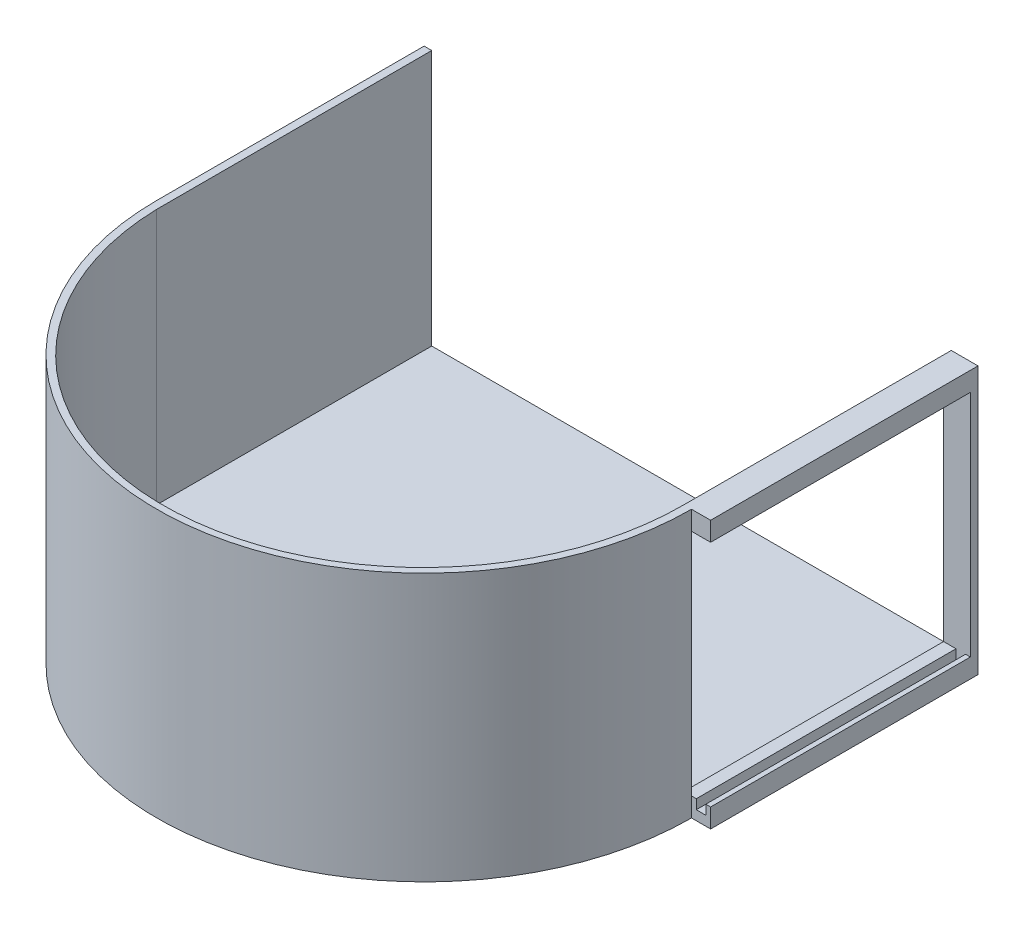
ISO-10303-21;
HEADER;
FILE_DESCRIPTION(('STEP AP214'),'2;1');
FILE_NAME('part.step','',(''),(''),'','','');
FILE_SCHEMA(('AUTOMOTIVE_DESIGN { 1 0 10303 214 1 1 1 1 }'));
ENDSEC;
DATA;
#1=APPLICATION_CONTEXT('core data for automotive mechanical design processes');
#2=APPLICATION_PROTOCOL_DEFINITION('international standard','automotive_design',2000,#1);
#3=PRODUCT_CONTEXT('',#1,'mechanical');
#4=PRODUCT('Part','Part','',(#3));
#5=PRODUCT_RELATED_PRODUCT_CATEGORY('part','',(#4));
#6=PRODUCT_DEFINITION_FORMATION('','',#4);
#7=PRODUCT_DEFINITION_CONTEXT('part definition',#1,'design');
#8=PRODUCT_DEFINITION('design','',#6,#7);
#9=PRODUCT_DEFINITION_SHAPE('','',#8);
#10=(LENGTH_UNIT() NAMED_UNIT(*) SI_UNIT(.MILLI.,.METRE.));
#11=(NAMED_UNIT(*) PLANE_ANGLE_UNIT() SI_UNIT($,.RADIAN.));
#12=(NAMED_UNIT(*) SI_UNIT($,.STERADIAN.) SOLID_ANGLE_UNIT());
#13=UNCERTAINTY_MEASURE_WITH_UNIT(LENGTH_MEASURE(1.E-05),#10,'distance_accuracy_value','');
#14=(GEOMETRIC_REPRESENTATION_CONTEXT(3) GLOBAL_UNCERTAINTY_ASSIGNED_CONTEXT((#13)) GLOBAL_UNIT_ASSIGNED_CONTEXT((#10,
#11,#12)) REPRESENTATION_CONTEXT('',''));
#15=CARTESIAN_POINT('',(0.,0.,0.));
#16=DIRECTION('',(0.,0.,1.));
#17=DIRECTION('',(1.,0.,0.));
#18=AXIS2_PLACEMENT_3D('',#15,#16,#17);
#19=CARTESIAN_POINT('',(184.15,6.35,0.));
#20=DIRECTION('',(0.,-1.,0.));
#21=DIRECTION('',(0.,0.,-1.));
#22=AXIS2_PLACEMENT_3D('',#19,#20,#21);
#23=PLANE('',#22);
#24=DIRECTION('',(0.,0.,1.));
#25=VECTOR('',#24,1.);
#26=CARTESIAN_POINT('',(179.3875,6.35,0.));
#27=LINE('',#26,#25);
#28=CARTESIAN_POINT('',(179.3875,6.35,-86.36));
#29=VERTEX_POINT('',#28);
#30=CARTESIAN_POINT('',(179.3875,6.35,0.));
#31=VERTEX_POINT('',#30);
#32=EDGE_CURVE('E506',#29,#31,#27,.T.);
#33=ORIENTED_EDGE('',*,*,#32,.F.);
#34=DIRECTION('',(-1.,0.,0.));
#35=VECTOR('',#34,1.);
#36=CARTESIAN_POINT('',(184.15,6.35,-86.36));
#37=LINE('',#36,#35);
#38=CARTESIAN_POINT('',(175.26,6.35,-86.36));
#39=VERTEX_POINT('',#38);
#40=EDGE_CURVE('E183',#29,#39,#37,.T.);
#41=ORIENTED_EDGE('',*,*,#40,.T.);
#42=DIRECTION('',(0.,0.,-1.));
#43=VECTOR('',#42,1.);
#44=CARTESIAN_POINT('',(175.26,6.35,0.));
#45=LINE('',#44,#43);
#46=CARTESIAN_POINT('',(175.26,6.35,0.));
#47=VERTEX_POINT('',#46);
#48=EDGE_CURVE('E185',#47,#39,#45,.T.);
#49=ORIENTED_EDGE('',*,*,#48,.F.);
#50=DIRECTION('',(1.,0.,0.));
#51=VECTOR('',#50,1.);
#52=CARTESIAN_POINT('',(175.26,6.35,0.));
#53=LINE('',#52,#51);
#54=CARTESIAN_POINT('',(177.8,6.35,0.));
#55=VERTEX_POINT('',#54);
#56=EDGE_CURVE('E169',#47,#55,#53,.T.);
#57=ORIENTED_EDGE('',*,*,#56,.T.);
#58=DIRECTION('',(-1.,0.,0.));
#59=VECTOR('',#58,1.);
#60=CARTESIAN_POINT('',(184.15,6.35,0.));
#61=LINE('',#60,#59);
#62=EDGE_CURVE('E259',#31,#55,#61,.T.);
#63=ORIENTED_EDGE('',*,*,#62,.F.);
#64=EDGE_LOOP('',(#33,#41,#49,#57,#63));
#65=FACE_BOUND('',#64,.T.);
#66=ADVANCED_FACE('F39',(#65),#23,.F.);
#67=DIRECTION('',(0.,0.,-1.));
#68=VECTOR('',#67,1.);
#69=CARTESIAN_POINT('',(182.5625,6.35,0.));
#70=LINE('',#69,#68);
#71=CARTESIAN_POINT('',(182.5625,6.35,0.));
#72=VERTEX_POINT('',#71);
#73=CARTESIAN_POINT('',(182.5625,6.35,-86.36));
#74=VERTEX_POINT('',#73);
#75=EDGE_CURVE('E501',#72,#74,#70,.T.);
#76=ORIENTED_EDGE('',*,*,#75,.F.);
#77=CARTESIAN_POINT('',(184.15,6.35,0.));
#78=VERTEX_POINT('',#77);
#79=EDGE_CURVE('E277',#78,#72,#61,.T.);
#80=ORIENTED_EDGE('',*,*,#79,.F.);
#81=DIRECTION('',(0.,0.,1.));
#82=VECTOR('',#81,1.);
#83=CARTESIAN_POINT('',(184.15,6.35,0.));
#84=LINE('',#83,#82);
#85=CARTESIAN_POINT('',(184.15,6.35,-86.36));
#86=VERTEX_POINT('',#85);
#87=EDGE_CURVE('E514',#86,#78,#84,.T.);
#88=ORIENTED_EDGE('',*,*,#87,.F.);
#89=EDGE_CURVE('E276',#86,#74,#37,.T.);
#90=ORIENTED_EDGE('',*,*,#89,.T.);
#91=EDGE_LOOP('',(#76,#80,#88,#90));
#92=FACE_BOUND('',#91,.T.);
#93=ADVANCED_FACE('F320',(#92),#23,.F.);
#94=CARTESIAN_POINT('',(88.9,88.9,0.));
#95=DIRECTION('',(0.,-1.,0.));
#96=DIRECTION('',(0.,0.,-1.));
#97=AXIS2_PLACEMENT_3D('',#94,#95,#96);
#98=CYLINDRICAL_SURFACE('',#97,88.9);
#99=CARTESIAN_POINT('',(88.9,0.,0.));
#100=DIRECTION('',(0.,1.,0.));
#101=DIRECTION('',(0.,0.,1.));
#102=AXIS2_PLACEMENT_3D('',#99,#100,#101);
#103=CIRCLE('',#102,88.9);
#104=CARTESIAN_POINT('',(0.,0.,0.));
#105=VERTEX_POINT('',#104);
#106=CARTESIAN_POINT('',(177.8,0.,0.));
#107=VERTEX_POINT('',#106);
#108=EDGE_CURVE('E223',#105,#107,#103,.T.);
#109=ORIENTED_EDGE('',*,*,#108,.T.);
#110=DIRECTION('',(0.,-1.,0.));
#111=VECTOR('',#110,1.);
#112=CARTESIAN_POINT('',(177.8,0.,0.));
#113=LINE('',#112,#111);
#114=EDGE_CURVE('E252',#55,#107,#113,.T.);
#115=ORIENTED_EDGE('',*,*,#114,.F.);
#116=DIRECTION('',(0.,-1.,0.));
#117=VECTOR('',#116,1.);
#118=CARTESIAN_POINT('',(177.8,88.9,0.));
#119=LINE('',#118,#117);
#120=CARTESIAN_POINT('',(177.8,82.55,0.));
#121=VERTEX_POINT('',#120);
#122=EDGE_CURVE('E50',#121,#55,#119,.T.);
#123=ORIENTED_EDGE('',*,*,#122,.F.);
#124=CARTESIAN_POINT('',(177.8,88.9,0.));
#125=VERTEX_POINT('',#124);
#126=EDGE_CURVE('E11',#125,#121,#119,.T.);
#127=ORIENTED_EDGE('',*,*,#126,.F.);
#128=CARTESIAN_POINT('',(88.9,88.9,0.));
#129=DIRECTION('',(0.,1.,0.));
#130=DIRECTION('',(0.,0.,1.));
#131=AXIS2_PLACEMENT_3D('',#128,#129,#130);
#132=CIRCLE('',#131,88.9);
#133=CARTESIAN_POINT('',(0.,88.9,0.));
#134=VERTEX_POINT('',#133);
#135=EDGE_CURVE('E214',#134,#125,#132,.T.);
#136=ORIENTED_EDGE('',*,*,#135,.F.);
#137=DIRECTION('',(0.,-1.,0.));
#138=VECTOR('',#137,1.);
#139=CARTESIAN_POINT('',(0.,88.9,0.));
#140=LINE('',#139,#138);
#141=EDGE_CURVE('E221',#134,#105,#140,.T.);
#142=ORIENTED_EDGE('',*,*,#141,.T.);
#143=EDGE_LOOP('',(#109,#115,#123,#127,#136,#142));
#144=FACE_BOUND('',#143,.T.);
#145=ADVANCED_FACE('F41',(#144),#98,.T.);
#146=CARTESIAN_POINT('',(0.,88.9,-88.9));
#147=DIRECTION('',(0.,0.,1.));
#148=DIRECTION('',(1.,0.,0.));
#149=AXIS2_PLACEMENT_3D('',#146,#147,#148);
#150=PLANE('',#149);
#151=DIRECTION('',(-1.,0.,0.));
#152=VECTOR('',#151,1.);
#153=CARTESIAN_POINT('',(2.53999999999999,3.80999999999999,-88.9));
#154=LINE('',#153,#152);
#155=CARTESIAN_POINT('',(175.26,3.80999999999999,-88.9));
#156=VERTEX_POINT('',#155);
#157=CARTESIAN_POINT('',(2.53999999999999,3.80999999999999,-88.9));
#158=VERTEX_POINT('',#157);
#159=EDGE_CURVE('E212',#156,#158,#154,.T.);
#160=ORIENTED_EDGE('',*,*,#159,.F.);
#161=DIRECTION('',(0.,1.,0.));
#162=VECTOR('',#161,1.);
#163=CARTESIAN_POINT('',(175.26,3.80999999999999,-88.9));
#164=LINE('',#163,#162);
#165=CARTESIAN_POINT('',(175.26,88.9,-88.9));
#166=VERTEX_POINT('',#165);
#167=EDGE_CURVE('E204',#156,#166,#164,.T.);
#168=ORIENTED_EDGE('',*,*,#167,.T.);
#169=DIRECTION('',(-1.,0.,0.));
#170=VECTOR('',#169,1.);
#171=CARTESIAN_POINT('',(0.,88.9,-88.9));
#172=LINE('',#171,#170);
#173=CARTESIAN_POINT('',(184.15,88.9,-88.9));
#174=VERTEX_POINT('',#173);
#175=EDGE_CURVE('E218',#174,#166,#172,.T.);
#176=ORIENTED_EDGE('',*,*,#175,.F.);
#177=DIRECTION('',(0.,1.,0.));
#178=VECTOR('',#177,1.);
#179=CARTESIAN_POINT('',(184.15,88.9,-88.9));
#180=LINE('',#179,#178);
#181=CARTESIAN_POINT('',(184.15,0.,-88.9));
#182=VERTEX_POINT('',#181);
#183=EDGE_CURVE('E530',#182,#174,#180,.T.);
#184=ORIENTED_EDGE('',*,*,#183,.F.);
#185=DIRECTION('',(-1.,0.,0.));
#186=VECTOR('',#185,1.);
#187=CARTESIAN_POINT('',(0.,0.,-88.9));
#188=LINE('',#187,#186);
#189=CARTESIAN_POINT('',(0.,0.,-88.9));
#190=VERTEX_POINT('',#189);
#191=EDGE_CURVE('E229',#182,#190,#188,.T.);
#192=ORIENTED_EDGE('',*,*,#191,.T.);
#193=DIRECTION('',(0.,-1.,0.));
#194=VECTOR('',#193,1.);
#195=CARTESIAN_POINT('',(0.,88.9,-88.9));
#196=LINE('',#195,#194);
#197=CARTESIAN_POINT('',(0.,88.9,-88.9));
#198=VERTEX_POINT('',#197);
#199=EDGE_CURVE('E233',#198,#190,#196,.T.);
#200=ORIENTED_EDGE('',*,*,#199,.F.);
#201=CARTESIAN_POINT('',(2.53999999999999,88.9,-88.9));
#202=VERTEX_POINT('',#201);
#203=EDGE_CURVE('E220',#202,#198,#172,.T.);
#204=ORIENTED_EDGE('',*,*,#203,.F.);
#205=DIRECTION('',(0.,1.,0.));
#206=VECTOR('',#205,1.);
#207=CARTESIAN_POINT('',(2.53999999999999,3.80999999999999,-88.9));
#208=LINE('',#207,#206);
#209=EDGE_CURVE('E210',#158,#202,#208,.T.);
#210=ORIENTED_EDGE('',*,*,#209,.F.);
#211=EDGE_LOOP('',(#160,#168,#176,#184,#192,#200,#204,#210));
#212=FACE_BOUND('',#211,.T.);
#213=ADVANCED_FACE('F306',(#212),#150,.F.);
#214=CARTESIAN_POINT('',(0.,88.9,0.));
#215=DIRECTION('',(1.,0.,0.));
#216=DIRECTION('',(0.,0.,-1.));
#217=AXIS2_PLACEMENT_3D('',#214,#215,#216);
#218=PLANE('',#217);
#219=DIRECTION('',(0.,0.,1.));
#220=VECTOR('',#219,1.);
#221=CARTESIAN_POINT('',(0.,0.,0.));
#222=LINE('',#221,#220);
#223=EDGE_CURVE('E217',#190,#105,#222,.T.);
#224=ORIENTED_EDGE('',*,*,#223,.T.);
#225=ORIENTED_EDGE('',*,*,#141,.F.);
#226=DIRECTION('',(0.,0.,1.));
#227=VECTOR('',#226,1.);
#228=CARTESIAN_POINT('',(0.,88.9,0.));
#229=LINE('',#228,#227);
#230=EDGE_CURVE('E225',#198,#134,#229,.T.);
#231=ORIENTED_EDGE('',*,*,#230,.F.);
#232=ORIENTED_EDGE('',*,*,#199,.T.);
#233=EDGE_LOOP('',(#224,#225,#231,#232));
#234=FACE_BOUND('',#233,.T.);
#235=ADVANCED_FACE('F240',(#234),#218,.F.);
#236=CARTESIAN_POINT('',(88.9,88.9,0.));
#237=DIRECTION('',(0.,1.,0.));
#238=DIRECTION('',(0.,0.,1.));
#239=AXIS2_PLACEMENT_3D('',#236,#237,#238);
#240=PLANE('',#239);
#241=DIRECTION('',(0.,0.,1.));
#242=VECTOR('',#241,1.);
#243=CARTESIAN_POINT('',(2.53999999999999,88.9,-88.9));
#244=LINE('',#243,#242);
#245=CARTESIAN_POINT('',(2.53999999999999,88.9,2.54));
#246=VERTEX_POINT('',#245);
#247=EDGE_CURVE('E288',#202,#246,#244,.T.);
#248=ORIENTED_EDGE('',*,*,#247,.F.);
#249=ORIENTED_EDGE('',*,*,#203,.T.);
#250=ORIENTED_EDGE('',*,*,#230,.T.);
#251=ORIENTED_EDGE('',*,*,#135,.T.);
#252=DIRECTION('',(-1.,0.,0.));
#253=VECTOR('',#252,1.);
#254=CARTESIAN_POINT('',(184.15,88.9,0.));
#255=LINE('',#254,#253);
#256=CARTESIAN_POINT('',(184.15,88.9,0.));
#257=VERTEX_POINT('',#256);
#258=EDGE_CURVE('E275',#257,#125,#255,.T.);
#259=ORIENTED_EDGE('',*,*,#258,.F.);
#260=DIRECTION('',(0.,0.,1.));
#261=VECTOR('',#260,1.);
#262=CARTESIAN_POINT('',(184.15,88.9,0.));
#263=LINE('',#262,#261);
#264=EDGE_CURVE('E269',#174,#257,#263,.T.);
#265=ORIENTED_EDGE('',*,*,#264,.F.);
#266=ORIENTED_EDGE('',*,*,#175,.T.);
#267=DIRECTION('',(0.,0.,-1.));
#268=VECTOR('',#267,1.);
#269=CARTESIAN_POINT('',(175.26,88.9,-88.9));
#270=LINE('',#269,#268);
#271=CARTESIAN_POINT('',(175.26,88.9,0.));
#272=VERTEX_POINT('',#271);
#273=EDGE_CURVE('E292',#272,#166,#270,.T.);
#274=ORIENTED_EDGE('',*,*,#273,.F.);
#275=CARTESIAN_POINT('',(88.8861359782854,88.9,0.327246523409812));
#276=DIRECTION('',(0.,1.,0.));
#277=DIRECTION('',(0.,0.,1.));
#278=AXIS2_PLACEMENT_3D('',#275,#276,#277);
#279=CIRCLE('',#278,86.3744839424741);
#280=EDGE_CURVE('E299',#246,#272,#279,.T.);
#281=ORIENTED_EDGE('',*,*,#280,.F.);
#282=EDGE_LOOP('',(#248,#249,#250,#251,#259,#265,#266,#274,#281));
#283=FACE_BOUND('',#282,.T.);
#284=ADVANCED_FACE('F308',(#283),#240,.T.);
#285=CARTESIAN_POINT('',(88.9,0.,0.));
#286=DIRECTION('',(0.,1.,0.));
#287=DIRECTION('',(0.,0.,1.));
#288=AXIS2_PLACEMENT_3D('',#285,#286,#287);
#289=PLANE('',#288);
#290=ORIENTED_EDGE('',*,*,#108,.F.);
#291=ORIENTED_EDGE('',*,*,#223,.F.);
#292=ORIENTED_EDGE('',*,*,#191,.F.);
#293=DIRECTION('',(0.,0.,-1.));
#294=VECTOR('',#293,1.);
#295=CARTESIAN_POINT('',(184.15,0.,-88.9));
#296=LINE('',#295,#294);
#297=CARTESIAN_POINT('',(184.15,0.,0.));
#298=VERTEX_POINT('',#297);
#299=EDGE_CURVE('E526',#298,#182,#296,.T.);
#300=ORIENTED_EDGE('',*,*,#299,.F.);
#301=DIRECTION('',(-1.,0.,0.));
#302=VECTOR('',#301,1.);
#303=CARTESIAN_POINT('',(184.15,0.,0.));
#304=LINE('',#303,#302);
#305=EDGE_CURVE('E247',#298,#107,#304,.T.);
#306=ORIENTED_EDGE('',*,*,#305,.T.);
#307=EDGE_LOOP('',(#290,#291,#292,#300,#306));
#308=FACE_BOUND('',#307,.T.);
#309=ADVANCED_FACE('F242',(#308),#289,.F.);
#310=CARTESIAN_POINT('',(2.53999999999999,3.80999999999999,-88.9));
#311=DIRECTION('',(-1.,0.,0.));
#312=DIRECTION('',(0.,0.,1.));
#313=AXIS2_PLACEMENT_3D('',#310,#311,#312);
#314=PLANE('',#313);
#315=ORIENTED_EDGE('',*,*,#247,.T.);
#316=DIRECTION('',(0.,1.,0.));
#317=VECTOR('',#316,1.);
#318=CARTESIAN_POINT('',(2.53999999999999,3.80999999999999,2.54));
#319=LINE('',#318,#317);
#320=CARTESIAN_POINT('',(2.53999999999999,3.80999999999999,2.54));
#321=VERTEX_POINT('',#320);
#322=EDGE_CURVE('E207',#321,#246,#319,.T.);
#323=ORIENTED_EDGE('',*,*,#322,.F.);
#324=DIRECTION('',(0.,0.,1.));
#325=VECTOR('',#324,1.);
#326=CARTESIAN_POINT('',(2.53999999999999,3.80999999999999,-88.9));
#327=LINE('',#326,#325);
#328=EDGE_CURVE('E289',#158,#321,#327,.T.);
#329=ORIENTED_EDGE('',*,*,#328,.F.);
#330=ORIENTED_EDGE('',*,*,#209,.T.);
#331=EDGE_LOOP('',(#315,#323,#329,#330));
#332=FACE_BOUND('',#331,.T.);
#333=ADVANCED_FACE('F304',(#332),#314,.F.);
#334=CARTESIAN_POINT('',(175.26,3.80999999999999,-88.9));
#335=DIRECTION('',(1.,0.,0.));
#336=DIRECTION('',(0.,0.,-1.));
#337=AXIS2_PLACEMENT_3D('',#334,#335,#336);
#338=PLANE('',#337);
#339=DIRECTION('',(0.,1.,0.));
#340=VECTOR('',#339,1.);
#341=CARTESIAN_POINT('',(175.26,82.55,-86.36));
#342=LINE('',#341,#340);
#343=CARTESIAN_POINT('',(175.26,82.55,-86.36));
#344=VERTEX_POINT('',#343);
#345=EDGE_CURVE('E190',#39,#344,#342,.T.);
#346=ORIENTED_EDGE('',*,*,#345,.T.);
#347=DIRECTION('',(0.,0.,1.));
#348=VECTOR('',#347,1.);
#349=CARTESIAN_POINT('',(175.26,82.55,0.));
#350=LINE('',#349,#348);
#351=CARTESIAN_POINT('',(175.26,82.55,0.));
#352=VERTEX_POINT('',#351);
#353=EDGE_CURVE('E180',#344,#352,#350,.T.);
#354=ORIENTED_EDGE('',*,*,#353,.T.);
#355=DIRECTION('',(0.,1.,0.));
#356=VECTOR('',#355,1.);
#357=CARTESIAN_POINT('',(175.26,3.80999999999999,0.));
#358=LINE('',#357,#356);
#359=EDGE_CURVE('E196',#352,#272,#358,.T.);
#360=ORIENTED_EDGE('',*,*,#359,.T.);
#361=ORIENTED_EDGE('',*,*,#273,.T.);
#362=ORIENTED_EDGE('',*,*,#167,.F.);
#363=DIRECTION('',(0.,0.,-1.));
#364=VECTOR('',#363,1.);
#365=CARTESIAN_POINT('',(175.26,3.80999999999999,-88.9));
#366=LINE('',#365,#364);
#367=CARTESIAN_POINT('',(175.26,3.80999999999999,0.));
#368=VERTEX_POINT('',#367);
#369=EDGE_CURVE('E205',#368,#156,#366,.T.);
#370=ORIENTED_EDGE('',*,*,#369,.F.);
#371=EDGE_CURVE('E198',#368,#47,#358,.T.);
#372=ORIENTED_EDGE('',*,*,#371,.T.);
#373=ORIENTED_EDGE('',*,*,#48,.T.);
#374=EDGE_LOOP('',(#346,#354,#360,#361,#362,#370,#372,#373));
#375=FACE_BOUND('',#374,.T.);
#376=ADVANCED_FACE('F199',(#375),#338,.F.);
#377=CARTESIAN_POINT('',(88.8861359782854,3.80999999999999,0.327246523409812));
#378=DIRECTION('',(0.,1.,0.));
#379=DIRECTION('',(0.,0.,1.));
#380=AXIS2_PLACEMENT_3D('',#377,#378,#379);
#381=CYLINDRICAL_SURFACE('',#380,86.3744839424741);
#382=ORIENTED_EDGE('',*,*,#280,.T.);
#383=ORIENTED_EDGE('',*,*,#359,.F.);
#384=DIRECTION('',(0.,-1.,0.));
#385=VECTOR('',#384,1.);
#386=CARTESIAN_POINT('',(175.26,82.55,0.));
#387=LINE('',#386,#385);
#388=EDGE_CURVE('E174',#352,#47,#387,.T.);
#389=ORIENTED_EDGE('',*,*,#388,.T.);
#390=ORIENTED_EDGE('',*,*,#371,.F.);
#391=CARTESIAN_POINT('',(88.8861359782854,3.80999999999999,0.327246523409812));
#392=DIRECTION('',(0.,1.,0.));
#393=DIRECTION('',(0.,0.,1.));
#394=AXIS2_PLACEMENT_3D('',#391,#392,#393);
#395=CIRCLE('',#394,86.3744839424741);
#396=EDGE_CURVE('E286',#321,#368,#395,.T.);
#397=ORIENTED_EDGE('',*,*,#396,.F.);
#398=ORIENTED_EDGE('',*,*,#322,.T.);
#399=EDGE_LOOP('',(#382,#383,#389,#390,#397,#398));
#400=FACE_BOUND('',#399,.T.);
#401=ADVANCED_FACE('F195',(#400),#381,.F.);
#402=CARTESIAN_POINT('',(88.8861359782854,3.80999999999999,0.327246523409812));
#403=DIRECTION('',(0.,1.,0.));
#404=DIRECTION('',(0.,0.,1.));
#405=AXIS2_PLACEMENT_3D('',#402,#403,#404);
#406=PLANE('',#405);
#407=ORIENTED_EDGE('',*,*,#328,.T.);
#408=ORIENTED_EDGE('',*,*,#396,.T.);
#409=ORIENTED_EDGE('',*,*,#369,.T.);
#410=ORIENTED_EDGE('',*,*,#159,.T.);
#411=EDGE_LOOP('',(#407,#408,#409,#410));
#412=FACE_BOUND('',#411,.T.);
#413=ADVANCED_FACE('F337',(#412),#406,.T.);
#414=CARTESIAN_POINT('',(184.15,82.55,0.));
#415=DIRECTION('',(0.,0.,-1.));
#416=DIRECTION('',(-1.,0.,0.));
#417=AXIS2_PLACEMENT_3D('',#414,#415,#416);
#418=PLANE('',#417);
#419=ORIENTED_EDGE('',*,*,#126,.T.);
#420=DIRECTION('',(-1.,0.,0.));
#421=VECTOR('',#420,1.);
#422=CARTESIAN_POINT('',(184.15,82.55,0.));
#423=LINE('',#422,#421);
#424=CARTESIAN_POINT('',(184.15,82.55,0.));
#425=VERTEX_POINT('',#424);
#426=EDGE_CURVE('E282',#425,#121,#423,.T.);
#427=ORIENTED_EDGE('',*,*,#426,.F.);
#428=DIRECTION('',(0.,-1.,0.));
#429=VECTOR('',#428,1.);
#430=CARTESIAN_POINT('',(184.15,82.55,0.));
#431=LINE('',#430,#429);
#432=EDGE_CURVE('E257',#257,#425,#431,.T.);
#433=ORIENTED_EDGE('',*,*,#432,.F.);
#434=ORIENTED_EDGE('',*,*,#258,.T.);
#435=EDGE_LOOP('',(#419,#427,#433,#434));
#436=FACE_BOUND('',#435,.T.);
#437=ADVANCED_FACE('F331',(#436),#418,.F.);
#438=CARTESIAN_POINT('',(184.15,82.55,-86.36));
#439=DIRECTION('',(0.,1.,0.));
#440=DIRECTION('',(0.,0.,1.));
#441=AXIS2_PLACEMENT_3D('',#438,#439,#440);
#442=PLANE('',#441);
#443=ORIENTED_EDGE('',*,*,#426,.T.);
#444=DIRECTION('',(1.,0.,0.));
#445=VECTOR('',#444,1.);
#446=CARTESIAN_POINT('',(175.26,82.55,0.));
#447=LINE('',#446,#445);
#448=EDGE_CURVE('E177',#352,#121,#447,.T.);
#449=ORIENTED_EDGE('',*,*,#448,.F.);
#450=ORIENTED_EDGE('',*,*,#353,.F.);
#451=DIRECTION('',(-1.,0.,0.));
#452=VECTOR('',#451,1.);
#453=CARTESIAN_POINT('',(184.15,82.55,-86.36));
#454=LINE('',#453,#452);
#455=CARTESIAN_POINT('',(184.15,82.55,-86.36));
#456=VERTEX_POINT('',#455);
#457=EDGE_CURVE('E53',#456,#344,#454,.T.);
#458=ORIENTED_EDGE('',*,*,#457,.F.);
#459=DIRECTION('',(0.,0.,-1.));
#460=VECTOR('',#459,1.);
#461=CARTESIAN_POINT('',(184.15,82.55,-86.36));
#462=LINE('',#461,#460);
#463=EDGE_CURVE('E262',#425,#456,#462,.T.);
#464=ORIENTED_EDGE('',*,*,#463,.F.);
#465=EDGE_LOOP('',(#443,#449,#450,#458,#464));
#466=FACE_BOUND('',#465,.T.);
#467=ADVANCED_FACE('F332',(#466),#442,.F.);
#468=CARTESIAN_POINT('',(184.15,6.35,-86.36));
#469=DIRECTION('',(0.,0.,-1.));
#470=DIRECTION('',(-1.,0.,0.));
#471=AXIS2_PLACEMENT_3D('',#468,#469,#470);
#472=PLANE('',#471);
#473=ORIENTED_EDGE('',*,*,#457,.T.);
#474=ORIENTED_EDGE('',*,*,#345,.F.);
#475=ORIENTED_EDGE('',*,*,#40,.F.);
#476=DIRECTION('',(0.,1.,0.));
#477=VECTOR('',#476,1.);
#478=CARTESIAN_POINT('',(179.3875,3.175,-86.36));
#479=LINE('',#478,#477);
#480=CARTESIAN_POINT('',(179.3875,3.175,-86.36));
#481=VERTEX_POINT('',#480);
#482=EDGE_CURVE('E261',#481,#29,#479,.T.);
#483=ORIENTED_EDGE('',*,*,#482,.F.);
#484=DIRECTION('',(-1.,0.,0.));
#485=VECTOR('',#484,1.);
#486=CARTESIAN_POINT('',(179.3875,3.175,-86.36));
#487=LINE('',#486,#485);
#488=CARTESIAN_POINT('',(182.5625,3.175,-86.36));
#489=VERTEX_POINT('',#488);
#490=EDGE_CURVE('E519',#489,#481,#487,.T.);
#491=ORIENTED_EDGE('',*,*,#490,.F.);
#492=DIRECTION('',(0.,1.,0.));
#493=VECTOR('',#492,1.);
#494=CARTESIAN_POINT('',(182.5625,3.175,-86.36));
#495=LINE('',#494,#493);
#496=EDGE_CURVE('E266',#489,#74,#495,.T.);
#497=ORIENTED_EDGE('',*,*,#496,.T.);
#498=ORIENTED_EDGE('',*,*,#89,.F.);
#499=DIRECTION('',(0.,-1.,0.));
#500=VECTOR('',#499,1.);
#501=CARTESIAN_POINT('',(184.15,6.35,-86.36));
#502=LINE('',#501,#500);
#503=EDGE_CURVE('E513',#456,#86,#502,.T.);
#504=ORIENTED_EDGE('',*,*,#503,.F.);
#505=EDGE_LOOP('',(#473,#474,#475,#483,#491,#497,#498,#504));
#506=FACE_BOUND('',#505,.T.);
#507=ADVANCED_FACE('F327',(#506),#472,.F.);
#508=CARTESIAN_POINT('',(184.15,0.,0.));
#509=DIRECTION('',(0.,0.,-1.));
#510=DIRECTION('',(-1.,0.,0.));
#511=AXIS2_PLACEMENT_3D('',#508,#509,#510);
#512=PLANE('',#511);
#513=DIRECTION('',(1.,0.,0.));
#514=VECTOR('',#513,1.);
#515=CARTESIAN_POINT('',(179.3875,3.175,0.));
#516=LINE('',#515,#514);
#517=CARTESIAN_POINT('',(179.3875,3.175,0.));
#518=VERTEX_POINT('',#517);
#519=CARTESIAN_POINT('',(182.5625,3.175,0.));
#520=VERTEX_POINT('',#519);
#521=EDGE_CURVE('E540',#518,#520,#516,.T.);
#522=ORIENTED_EDGE('',*,*,#521,.F.);
#523=DIRECTION('',(0.,1.,0.));
#524=VECTOR('',#523,1.);
#525=CARTESIAN_POINT('',(179.3875,3.175,0.));
#526=LINE('',#525,#524);
#527=EDGE_CURVE('E520',#518,#31,#526,.T.);
#528=ORIENTED_EDGE('',*,*,#527,.T.);
#529=ORIENTED_EDGE('',*,*,#62,.T.);
#530=ORIENTED_EDGE('',*,*,#114,.T.);
#531=ORIENTED_EDGE('',*,*,#305,.F.);
#532=DIRECTION('',(0.,-1.,0.));
#533=VECTOR('',#532,1.);
#534=CARTESIAN_POINT('',(184.15,0.,0.));
#535=LINE('',#534,#533);
#536=EDGE_CURVE('E528',#78,#298,#535,.T.);
#537=ORIENTED_EDGE('',*,*,#536,.F.);
#538=ORIENTED_EDGE('',*,*,#79,.T.);
#539=DIRECTION('',(0.,1.,0.));
#540=VECTOR('',#539,1.);
#541=CARTESIAN_POINT('',(182.5625,3.175,0.));
#542=LINE('',#541,#540);
#543=EDGE_CURVE('E507',#520,#72,#542,.T.);
#544=ORIENTED_EDGE('',*,*,#543,.F.);
#545=EDGE_LOOP('',(#522,#528,#529,#530,#531,#537,#538,#544));
#546=FACE_BOUND('',#545,.T.);
#547=ADVANCED_FACE('F258',(#546),#512,.F.);
#548=CARTESIAN_POINT('',(184.15,0.,0.));
#549=DIRECTION('',(-1.,0.,0.));
#550=DIRECTION('',(0.,0.,1.));
#551=AXIS2_PLACEMENT_3D('',#548,#549,#550);
#552=PLANE('',#551);
#553=ORIENTED_EDGE('',*,*,#432,.T.);
#554=ORIENTED_EDGE('',*,*,#463,.T.);
#555=ORIENTED_EDGE('',*,*,#503,.T.);
#556=ORIENTED_EDGE('',*,*,#87,.T.);
#557=ORIENTED_EDGE('',*,*,#536,.T.);
#558=ORIENTED_EDGE('',*,*,#299,.T.);
#559=ORIENTED_EDGE('',*,*,#183,.T.);
#560=ORIENTED_EDGE('',*,*,#264,.T.);
#561=EDGE_LOOP('',(#553,#554,#555,#556,#557,#558,#559,#560));
#562=FACE_BOUND('',#561,.T.);
#563=ADVANCED_FACE('F360',(#562),#552,.F.);
#564=CARTESIAN_POINT('',(179.3875,3.175,0.));
#565=DIRECTION('',(-1.,0.,0.));
#566=DIRECTION('',(0.,0.,1.));
#567=AXIS2_PLACEMENT_3D('',#564,#565,#566);
#568=PLANE('',#567);
#569=ORIENTED_EDGE('',*,*,#32,.T.);
#570=ORIENTED_EDGE('',*,*,#527,.F.);
#571=DIRECTION('',(0.,0.,1.));
#572=VECTOR('',#571,1.);
#573=CARTESIAN_POINT('',(179.3875,3.175,0.));
#574=LINE('',#573,#572);
#575=EDGE_CURVE('E64',#481,#518,#574,.T.);
#576=ORIENTED_EDGE('',*,*,#575,.F.);
#577=ORIENTED_EDGE('',*,*,#482,.T.);
#578=EDGE_LOOP('',(#569,#570,#576,#577));
#579=FACE_BOUND('',#578,.T.);
#580=ADVANCED_FACE('F362',(#579),#568,.F.);
#581=CARTESIAN_POINT('',(182.5625,3.175,0.));
#582=DIRECTION('',(1.,0.,0.));
#583=DIRECTION('',(0.,0.,-1.));
#584=AXIS2_PLACEMENT_3D('',#581,#582,#583);
#585=PLANE('',#584);
#586=ORIENTED_EDGE('',*,*,#75,.T.);
#587=ORIENTED_EDGE('',*,*,#496,.F.);
#588=DIRECTION('',(0.,0.,-1.));
#589=VECTOR('',#588,1.);
#590=CARTESIAN_POINT('',(182.5625,3.175,0.));
#591=LINE('',#590,#589);
#592=EDGE_CURVE('E538',#520,#489,#591,.T.);
#593=ORIENTED_EDGE('',*,*,#592,.F.);
#594=ORIENTED_EDGE('',*,*,#543,.T.);
#595=EDGE_LOOP('',(#586,#587,#593,#594));
#596=FACE_BOUND('',#595,.T.);
#597=ADVANCED_FACE('F380',(#596),#585,.F.);
#598=CARTESIAN_POINT('',(0.,3.175,0.));
#599=DIRECTION('',(0.,-1.,0.));
#600=DIRECTION('',(0.,0.,-1.));
#601=AXIS2_PLACEMENT_3D('',#598,#599,#600);
#602=PLANE('',#601);
#603=ORIENTED_EDGE('',*,*,#575,.T.);
#604=ORIENTED_EDGE('',*,*,#521,.T.);
#605=ORIENTED_EDGE('',*,*,#592,.T.);
#606=ORIENTED_EDGE('',*,*,#490,.T.);
#607=EDGE_LOOP('',(#603,#604,#605,#606));
#608=FACE_BOUND('',#607,.T.);
#609=ADVANCED_FACE('F387',(#608),#602,.F.);
#610=CARTESIAN_POINT('',(175.26,82.55,0.));
#611=DIRECTION('',(0.,0.,1.));
#612=DIRECTION('',(1.,0.,0.));
#613=AXIS2_PLACEMENT_3D('',#610,#611,#612);
#614=PLANE('',#613);
#615=ORIENTED_EDGE('',*,*,#122,.T.);
#616=ORIENTED_EDGE('',*,*,#56,.F.);
#617=ORIENTED_EDGE('',*,*,#388,.F.);
#618=ORIENTED_EDGE('',*,*,#448,.T.);
#619=EDGE_LOOP('',(#615,#616,#617,#618));
#620=FACE_BOUND('',#619,.T.);
#621=ADVANCED_FACE('F168',(#620),#614,.F.);
#622=CLOSED_SHELL('',(#66,#93,#145,#213,#235,#284,#309,#333,#376,#401,#413,#437,#467,#507,#547,
#563,#580,#597,#609,#621));
#623=MANIFOLD_SOLID_BREP('B2',#622);
#624=ADVANCED_BREP_SHAPE_REPRESENTATION('',(#18,#623),#14);
#625=SHAPE_DEFINITION_REPRESENTATION(#9,#624);
ENDSEC;
END-ISO-10303-21;
